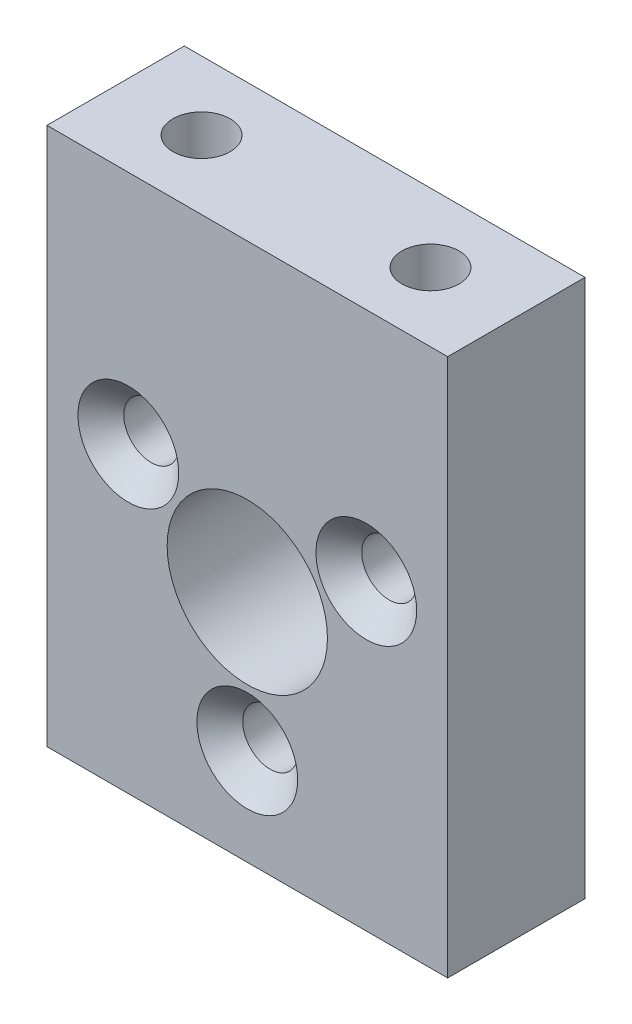
ISO-10303-21;
HEADER;
FILE_DESCRIPTION(('STEP AP214'),'2;1');
FILE_NAME('part.step','',(''),(''),'','','');
FILE_SCHEMA(('AUTOMOTIVE_DESIGN { 1 0 10303 214 1 1 1 1 }'));
ENDSEC;
DATA;
#1=APPLICATION_CONTEXT('core data for automotive mechanical design processes');
#2=APPLICATION_PROTOCOL_DEFINITION('international standard','automotive_design',2000,#1);
#3=PRODUCT_CONTEXT('',#1,'mechanical');
#4=PRODUCT('Part','Part','',(#3));
#5=PRODUCT_RELATED_PRODUCT_CATEGORY('part','',(#4));
#6=PRODUCT_DEFINITION_FORMATION('','',#4);
#7=PRODUCT_DEFINITION_CONTEXT('part definition',#1,'design');
#8=PRODUCT_DEFINITION('design','',#6,#7);
#9=PRODUCT_DEFINITION_SHAPE('','',#8);
#10=(LENGTH_UNIT() NAMED_UNIT(*) SI_UNIT(.MILLI.,.METRE.));
#11=(NAMED_UNIT(*) PLANE_ANGLE_UNIT() SI_UNIT($,.RADIAN.));
#12=(NAMED_UNIT(*) SI_UNIT($,.STERADIAN.) SOLID_ANGLE_UNIT());
#13=UNCERTAINTY_MEASURE_WITH_UNIT(LENGTH_MEASURE(1.E-05),#10,'distance_accuracy_value','');
#14=(GEOMETRIC_REPRESENTATION_CONTEXT(3) GLOBAL_UNCERTAINTY_ASSIGNED_CONTEXT((#13)) GLOBAL_UNIT_ASSIGNED_CONTEXT((#10,
#11,#12)) REPRESENTATION_CONTEXT('',''));
#15=CARTESIAN_POINT('',(0.,0.,0.));
#16=DIRECTION('',(0.,0.,1.));
#17=DIRECTION('',(1.,0.,0.));
#18=AXIS2_PLACEMENT_3D('',#15,#16,#17);
#19=CARTESIAN_POINT('',(0.,0.,3.));
#20=DIRECTION('',(0.,0.,-1.));
#21=DIRECTION('',(-1.,0.,0.));
#22=AXIS2_PLACEMENT_3D('',#19,#20,#21);
#23=PLANE('',#22);
#24=CARTESIAN_POINT('',(0.,-7.53,3.));
#25=DIRECTION('',(0.,0.,1.));
#26=DIRECTION('',(1.,0.,0.));
#27=AXIS2_PLACEMENT_3D('',#24,#25,#26);
#28=CIRCLE('',#27,2.2);
#29=CARTESIAN_POINT('',(2.2,-7.53,3.));
#30=VERTEX_POINT('',#29);
#31=EDGE_CURVE('E139',#30,#30,#28,.T.);
#32=ORIENTED_EDGE('',*,*,#31,.F.);
#33=EDGE_LOOP('',(#32));
#34=FACE_BOUND('',#33,.T.);
#35=CARTESIAN_POINT('',(-5.19615242270663,1.47,3.));
#36=DIRECTION('',(0.,0.,1.));
#37=DIRECTION('',(1.,0.,0.));
#38=AXIS2_PLACEMENT_3D('',#35,#36,#37);
#39=CIRCLE('',#38,2.2);
#40=CARTESIAN_POINT('',(-2.99615242270663,1.47,3.));
#41=VERTEX_POINT('',#40);
#42=EDGE_CURVE('E151',#41,#41,#39,.T.);
#43=ORIENTED_EDGE('',*,*,#42,.F.);
#44=EDGE_LOOP('',(#43));
#45=FACE_BOUND('',#44,.T.);
#46=CARTESIAN_POINT('',(5.19615242270663,1.47,3.));
#47=DIRECTION('',(0.,0.,1.));
#48=DIRECTION('',(1.,0.,0.));
#49=AXIS2_PLACEMENT_3D('',#46,#47,#48);
#50=CIRCLE('',#49,2.2);
#51=CARTESIAN_POINT('',(7.39615242270663,1.47,3.));
#52=VERTEX_POINT('',#51);
#53=EDGE_CURVE('E163',#52,#52,#50,.T.);
#54=ORIENTED_EDGE('',*,*,#53,.F.);
#55=EDGE_LOOP('',(#54));
#56=FACE_BOUND('',#55,.T.);
#57=DIRECTION('',(0.,1.,0.));
#58=VECTOR('',#57,1.);
#59=CARTESIAN_POINT('',(8.75,-11.75,3.));
#60=LINE('',#59,#58);
#61=CARTESIAN_POINT('',(8.75,-11.75,3.));
#62=VERTEX_POINT('',#61);
#63=CARTESIAN_POINT('',(8.75,11.75,3.));
#64=VERTEX_POINT('',#63);
#65=EDGE_CURVE('E184',#62,#64,#60,.T.);
#66=ORIENTED_EDGE('',*,*,#65,.T.);
#67=DIRECTION('',(-1.,0.,0.));
#68=VECTOR('',#67,1.);
#69=CARTESIAN_POINT('',(-8.75,11.75,3.));
#70=LINE('',#69,#68);
#71=CARTESIAN_POINT('',(-8.75,11.75,3.));
#72=VERTEX_POINT('',#71);
#73=EDGE_CURVE('E106',#64,#72,#70,.T.);
#74=ORIENTED_EDGE('',*,*,#73,.T.);
#75=DIRECTION('',(0.,-1.,0.));
#76=VECTOR('',#75,1.);
#77=CARTESIAN_POINT('',(-8.75,-11.75,3.));
#78=LINE('',#77,#76);
#79=CARTESIAN_POINT('',(-8.75,-11.75,3.));
#80=VERTEX_POINT('',#79);
#81=EDGE_CURVE('E189',#72,#80,#78,.T.);
#82=ORIENTED_EDGE('',*,*,#81,.T.);
#83=DIRECTION('',(1.,0.,0.));
#84=VECTOR('',#83,1.);
#85=CARTESIAN_POINT('',(-8.75,-11.75,3.));
#86=LINE('',#85,#84);
#87=EDGE_CURVE('E75',#80,#62,#86,.T.);
#88=ORIENTED_EDGE('',*,*,#87,.T.);
#89=EDGE_LOOP('',(#66,#74,#82,#88));
#90=FACE_BOUND('',#89,.T.);
#91=CARTESIAN_POINT('',(0.,-1.53,3.));
#92=DIRECTION('',(0.,0.,1.));
#93=DIRECTION('',(1.,0.,0.));
#94=AXIS2_PLACEMENT_3D('',#91,#92,#93);
#95=CIRCLE('',#94,3.5);
#96=CARTESIAN_POINT('',(3.5,-1.53,3.));
#97=VERTEX_POINT('',#96);
#98=EDGE_CURVE('E176',#97,#97,#95,.T.);
#99=ORIENTED_EDGE('',*,*,#98,.F.);
#100=EDGE_LOOP('',(#99));
#101=FACE_BOUND('',#100,.T.);
#102=ADVANCED_FACE('F57',(#34,#45,#56,#90,#101),#23,.F.);
#103=CARTESIAN_POINT('',(0.,0.,-3.));
#104=DIRECTION('',(0.,0.,-1.));
#105=DIRECTION('',(-1.,0.,0.));
#106=AXIS2_PLACEMENT_3D('',#103,#104,#105);
#107=PLANE('',#106);
#108=CARTESIAN_POINT('',(0.,-7.53,-3.));
#109=DIRECTION('',(0.,0.,1.));
#110=DIRECTION('',(1.,0.,0.));
#111=AXIS2_PLACEMENT_3D('',#108,#109,#110);
#112=CIRCLE('',#111,1.2);
#113=CARTESIAN_POINT('',(1.2,-7.53,-3.));
#114=VERTEX_POINT('',#113);
#115=EDGE_CURVE('E147',#114,#114,#112,.T.);
#116=ORIENTED_EDGE('',*,*,#115,.T.);
#117=EDGE_LOOP('',(#116));
#118=FACE_BOUND('',#117,.T.);
#119=CARTESIAN_POINT('',(-5.19615242270663,1.47,-3.));
#120=DIRECTION('',(0.,0.,1.));
#121=DIRECTION('',(1.,0.,0.));
#122=AXIS2_PLACEMENT_3D('',#119,#120,#121);
#123=CIRCLE('',#122,1.2);
#124=CARTESIAN_POINT('',(-3.99615242270664,1.47,-3.));
#125=VERTEX_POINT('',#124);
#126=EDGE_CURVE('E159',#125,#125,#123,.T.);
#127=ORIENTED_EDGE('',*,*,#126,.T.);
#128=EDGE_LOOP('',(#127));
#129=FACE_BOUND('',#128,.T.);
#130=CARTESIAN_POINT('',(5.19615242270663,1.47,-3.));
#131=DIRECTION('',(0.,0.,1.));
#132=DIRECTION('',(1.,0.,0.));
#133=AXIS2_PLACEMENT_3D('',#130,#131,#132);
#134=CIRCLE('',#133,1.2);
#135=CARTESIAN_POINT('',(6.39615242270663,1.47,-3.));
#136=VERTEX_POINT('',#135);
#137=EDGE_CURVE('E171',#136,#136,#134,.T.);
#138=ORIENTED_EDGE('',*,*,#137,.T.);
#139=EDGE_LOOP('',(#138));
#140=FACE_BOUND('',#139,.T.);
#141=DIRECTION('',(0.,1.,0.));
#142=VECTOR('',#141,1.);
#143=CARTESIAN_POINT('',(8.75,-11.75,-3.));
#144=LINE('',#143,#142);
#145=CARTESIAN_POINT('',(8.75,-11.75,-3.));
#146=VERTEX_POINT('',#145);
#147=CARTESIAN_POINT('',(8.75,11.75,-3.));
#148=VERTEX_POINT('',#147);
#149=EDGE_CURVE('E180',#146,#148,#144,.T.);
#150=ORIENTED_EDGE('',*,*,#149,.F.);
#151=DIRECTION('',(1.,0.,0.));
#152=VECTOR('',#151,1.);
#153=CARTESIAN_POINT('',(-8.75,-11.75,-3.));
#154=LINE('',#153,#152);
#155=CARTESIAN_POINT('',(-8.75,-11.75,-3.));
#156=VERTEX_POINT('',#155);
#157=EDGE_CURVE('E99',#156,#146,#154,.T.);
#158=ORIENTED_EDGE('',*,*,#157,.F.);
#159=DIRECTION('',(0.,-1.,0.));
#160=VECTOR('',#159,1.);
#161=CARTESIAN_POINT('',(-8.75,-11.75,-3.));
#162=LINE('',#161,#160);
#163=CARTESIAN_POINT('',(-8.75,11.75,-3.));
#164=VERTEX_POINT('',#163);
#165=EDGE_CURVE('E93',#164,#156,#162,.T.);
#166=ORIENTED_EDGE('',*,*,#165,.F.);
#167=DIRECTION('',(-1.,0.,0.));
#168=VECTOR('',#167,1.);
#169=CARTESIAN_POINT('',(-8.75,11.75,-3.));
#170=LINE('',#169,#168);
#171=EDGE_CURVE('E198',#148,#164,#170,.T.);
#172=ORIENTED_EDGE('',*,*,#171,.F.);
#173=EDGE_LOOP('',(#150,#158,#166,#172));
#174=FACE_BOUND('',#173,.T.);
#175=CARTESIAN_POINT('',(0.,-1.53,-3.));
#176=DIRECTION('',(0.,0.,1.));
#177=DIRECTION('',(1.,0.,0.));
#178=AXIS2_PLACEMENT_3D('',#175,#176,#177);
#179=CIRCLE('',#178,3.5);
#180=CARTESIAN_POINT('',(3.5,-1.53,-3.));
#181=VERTEX_POINT('',#180);
#182=EDGE_CURVE('E175',#181,#181,#179,.T.);
#183=ORIENTED_EDGE('',*,*,#182,.T.);
#184=EDGE_LOOP('',(#183));
#185=FACE_BOUND('',#184,.T.);
#186=ADVANCED_FACE('F215',(#118,#129,#140,#174,#185),#107,.T.);
#187=CARTESIAN_POINT('',(8.75,-11.75,3.));
#188=DIRECTION('',(-1.,0.,0.));
#189=DIRECTION('',(0.,0.,1.));
#190=AXIS2_PLACEMENT_3D('',#187,#188,#189);
#191=PLANE('',#190);
#192=ORIENTED_EDGE('',*,*,#149,.T.);
#193=DIRECTION('',(0.,0.,-1.));
#194=VECTOR('',#193,1.);
#195=CARTESIAN_POINT('',(8.75,11.75,3.));
#196=LINE('',#195,#194);
#197=EDGE_CURVE('E13',#64,#148,#196,.T.);
#198=ORIENTED_EDGE('',*,*,#197,.F.);
#199=ORIENTED_EDGE('',*,*,#65,.F.);
#200=DIRECTION('',(0.,0.,-1.));
#201=VECTOR('',#200,1.);
#202=CARTESIAN_POINT('',(8.75,-11.75,3.));
#203=LINE('',#202,#201);
#204=EDGE_CURVE('E194',#62,#146,#203,.T.);
#205=ORIENTED_EDGE('',*,*,#204,.T.);
#206=EDGE_LOOP('',(#192,#198,#199,#205));
#207=FACE_BOUND('',#206,.T.);
#208=ADVANCED_FACE('F59',(#207),#191,.F.);
#209=CARTESIAN_POINT('',(-8.75,11.75,3.));
#210=DIRECTION('',(0.,-1.,0.));
#211=DIRECTION('',(0.,0.,-1.));
#212=AXIS2_PLACEMENT_3D('',#209,#210,#211);
#213=PLANE('',#212);
#214=CARTESIAN_POINT('',(-5.,11.75,0.));
#215=DIRECTION('',(0.,1.,0.));
#216=DIRECTION('',(0.,0.,1.));
#217=AXIS2_PLACEMENT_3D('',#214,#215,#216);
#218=CIRCLE('',#217,1.24999999999999);
#219=CARTESIAN_POINT('',(-5.,11.75,1.24999999999999));
#220=VERTEX_POINT('',#219);
#221=EDGE_CURVE('E125',#220,#220,#218,.T.);
#222=ORIENTED_EDGE('',*,*,#221,.F.);
#223=EDGE_LOOP('',(#222));
#224=FACE_BOUND('',#223,.T.);
#225=CARTESIAN_POINT('',(5.,11.75,0.));
#226=DIRECTION('',(0.,1.,0.));
#227=DIRECTION('',(0.,0.,1.));
#228=AXIS2_PLACEMENT_3D('',#225,#226,#227);
#229=CIRCLE('',#228,1.24999999999999);
#230=CARTESIAN_POINT('',(5.,11.75,1.24999999999999));
#231=VERTEX_POINT('',#230);
#232=EDGE_CURVE('E124',#231,#231,#229,.T.);
#233=ORIENTED_EDGE('',*,*,#232,.F.);
#234=EDGE_LOOP('',(#233));
#235=FACE_BOUND('',#234,.T.);
#236=ORIENTED_EDGE('',*,*,#171,.T.);
#237=DIRECTION('',(0.,0.,-1.));
#238=VECTOR('',#237,1.);
#239=CARTESIAN_POINT('',(-8.75,11.75,3.));
#240=LINE('',#239,#238);
#241=EDGE_CURVE('E67',#72,#164,#240,.T.);
#242=ORIENTED_EDGE('',*,*,#241,.F.);
#243=ORIENTED_EDGE('',*,*,#73,.F.);
#244=ORIENTED_EDGE('',*,*,#197,.T.);
#245=EDGE_LOOP('',(#236,#242,#243,#244));
#246=FACE_BOUND('',#245,.T.);
#247=ADVANCED_FACE('F231',(#224,#235,#246),#213,.F.);
#248=CARTESIAN_POINT('',(-8.75,-11.75,3.));
#249=DIRECTION('',(1.,0.,0.));
#250=DIRECTION('',(0.,0.,-1.));
#251=AXIS2_PLACEMENT_3D('',#248,#249,#250);
#252=PLANE('',#251);
#253=ORIENTED_EDGE('',*,*,#165,.T.);
#254=DIRECTION('',(0.,0.,-1.));
#255=VECTOR('',#254,1.);
#256=CARTESIAN_POINT('',(-8.75,-11.75,3.));
#257=LINE('',#256,#255);
#258=EDGE_CURVE('E207',#80,#156,#257,.T.);
#259=ORIENTED_EDGE('',*,*,#258,.F.);
#260=ORIENTED_EDGE('',*,*,#81,.F.);
#261=ORIENTED_EDGE('',*,*,#241,.T.);
#262=EDGE_LOOP('',(#253,#259,#260,#261));
#263=FACE_BOUND('',#262,.T.);
#264=ADVANCED_FACE('F212',(#263),#252,.F.);
#265=CARTESIAN_POINT('',(-8.75,-11.75,3.));
#266=DIRECTION('',(0.,1.,0.));
#267=DIRECTION('',(0.,0.,1.));
#268=AXIS2_PLACEMENT_3D('',#265,#266,#267);
#269=PLANE('',#268);
#270=ORIENTED_EDGE('',*,*,#157,.T.);
#271=ORIENTED_EDGE('',*,*,#204,.F.);
#272=ORIENTED_EDGE('',*,*,#87,.F.);
#273=ORIENTED_EDGE('',*,*,#258,.T.);
#274=EDGE_LOOP('',(#270,#271,#272,#273));
#275=FACE_BOUND('',#274,.T.);
#276=ADVANCED_FACE('F220',(#275),#269,.F.);
#277=CARTESIAN_POINT('',(0.,-1.53,3.));
#278=DIRECTION('',(0.,0.,-1.));
#279=DIRECTION('',(-1.,0.,0.));
#280=AXIS2_PLACEMENT_3D('',#277,#278,#279);
#281=CYLINDRICAL_SURFACE('',#280,3.5);
#282=ORIENTED_EDGE('',*,*,#98,.T.);
#283=EDGE_LOOP('',(#282));
#284=FACE_BOUND('',#283,.T.);
#285=ORIENTED_EDGE('',*,*,#182,.F.);
#286=EDGE_LOOP('',(#285));
#287=FACE_BOUND('',#286,.T.);
#288=ADVANCED_FACE('F222',(#284,#287),#281,.F.);
#289=CARTESIAN_POINT('',(5.19615242270663,1.47,3.));
#290=DIRECTION('',(0.,0.,1.));
#291=DIRECTION('',(1.,0.,0.));
#292=AXIS2_PLACEMENT_3D('',#289,#290,#291);
#293=CYLINDRICAL_SURFACE('',#292,1.2);
#294=ORIENTED_EDGE('',*,*,#137,.F.);
#295=EDGE_LOOP('',(#294));
#296=FACE_BOUND('',#295,.T.);
#297=CARTESIAN_POINT('',(5.19615242270663,1.47,2.));
#298=DIRECTION('',(0.,0.,1.));
#299=DIRECTION('',(1.,0.,0.));
#300=AXIS2_PLACEMENT_3D('',#297,#298,#299);
#301=CIRCLE('',#300,1.2);
#302=CARTESIAN_POINT('',(6.39615242270663,1.47,2.));
#303=VERTEX_POINT('',#302);
#304=EDGE_CURVE('E167',#303,#303,#301,.T.);
#305=ORIENTED_EDGE('',*,*,#304,.T.);
#306=EDGE_LOOP('',(#305));
#307=FACE_BOUND('',#306,.T.);
#308=ADVANCED_FACE('F228',(#296,#307),#293,.F.);
#309=CARTESIAN_POINT('',(5.19615242270663,1.47,3.));
#310=DIRECTION('',(0.,0.,1.));
#311=DIRECTION('',(1.,0.,0.));
#312=AXIS2_PLACEMENT_3D('',#309,#310,#311);
#313=CONICAL_SURFACE('',#312,2.2,0.785398163397448);
#314=ORIENTED_EDGE('',*,*,#304,.F.);
#315=EDGE_LOOP('',(#314));
#316=FACE_BOUND('',#315,.T.);
#317=ORIENTED_EDGE('',*,*,#53,.T.);
#318=EDGE_LOOP('',(#317));
#319=FACE_BOUND('',#318,.T.);
#320=ADVANCED_FACE('F246',(#316,#319),#313,.F.);
#321=CARTESIAN_POINT('',(-5.19615242270663,1.47,3.));
#322=DIRECTION('',(0.,0.,1.));
#323=DIRECTION('',(1.,0.,0.));
#324=AXIS2_PLACEMENT_3D('',#321,#322,#323);
#325=CYLINDRICAL_SURFACE('',#324,1.2);
#326=ORIENTED_EDGE('',*,*,#126,.F.);
#327=EDGE_LOOP('',(#326));
#328=FACE_BOUND('',#327,.T.);
#329=CARTESIAN_POINT('',(-5.19615242270663,1.47,2.));
#330=DIRECTION('',(0.,0.,1.));
#331=DIRECTION('',(1.,0.,0.));
#332=AXIS2_PLACEMENT_3D('',#329,#330,#331);
#333=CIRCLE('',#332,1.2);
#334=CARTESIAN_POINT('',(-3.99615242270663,1.47,2.));
#335=VERTEX_POINT('',#334);
#336=EDGE_CURVE('E155',#335,#335,#333,.T.);
#337=ORIENTED_EDGE('',*,*,#336,.T.);
#338=EDGE_LOOP('',(#337));
#339=FACE_BOUND('',#338,.T.);
#340=ADVANCED_FACE('F250',(#328,#339),#325,.F.);
#341=CARTESIAN_POINT('',(-5.19615242270663,1.47,3.));
#342=DIRECTION('',(0.,0.,1.));
#343=DIRECTION('',(1.,0.,0.));
#344=AXIS2_PLACEMENT_3D('',#341,#342,#343);
#345=CONICAL_SURFACE('',#344,2.2,0.785398163397448);
#346=ORIENTED_EDGE('',*,*,#336,.F.);
#347=EDGE_LOOP('',(#346));
#348=FACE_BOUND('',#347,.T.);
#349=ORIENTED_EDGE('',*,*,#42,.T.);
#350=EDGE_LOOP('',(#349));
#351=FACE_BOUND('',#350,.T.);
#352=ADVANCED_FACE('F254',(#348,#351),#345,.F.);
#353=CARTESIAN_POINT('',(0.,-7.53,3.));
#354=DIRECTION('',(0.,0.,1.));
#355=DIRECTION('',(1.,0.,0.));
#356=AXIS2_PLACEMENT_3D('',#353,#354,#355);
#357=CYLINDRICAL_SURFACE('',#356,1.2);
#358=ORIENTED_EDGE('',*,*,#115,.F.);
#359=EDGE_LOOP('',(#358));
#360=FACE_BOUND('',#359,.T.);
#361=CARTESIAN_POINT('',(0.,-7.53,2.));
#362=DIRECTION('',(0.,0.,1.));
#363=DIRECTION('',(1.,0.,0.));
#364=AXIS2_PLACEMENT_3D('',#361,#362,#363);
#365=CIRCLE('',#364,1.2);
#366=CARTESIAN_POINT('',(1.2,-7.53,2.));
#367=VERTEX_POINT('',#366);
#368=EDGE_CURVE('E143',#367,#367,#365,.T.);
#369=ORIENTED_EDGE('',*,*,#368,.T.);
#370=EDGE_LOOP('',(#369));
#371=FACE_BOUND('',#370,.T.);
#372=ADVANCED_FACE('F258',(#360,#371),#357,.F.);
#373=CARTESIAN_POINT('',(0.,-7.53,3.));
#374=DIRECTION('',(0.,0.,1.));
#375=DIRECTION('',(1.,0.,0.));
#376=AXIS2_PLACEMENT_3D('',#373,#374,#375);
#377=CONICAL_SURFACE('',#376,2.2,0.785398163397448);
#378=ORIENTED_EDGE('',*,*,#368,.F.);
#379=EDGE_LOOP('',(#378));
#380=FACE_BOUND('',#379,.T.);
#381=ORIENTED_EDGE('',*,*,#31,.T.);
#382=EDGE_LOOP('',(#381));
#383=FACE_BOUND('',#382,.T.);
#384=ADVANCED_FACE('F262',(#380,#383),#377,.F.);
#385=CARTESIAN_POINT('',(5.,5.75,0.));
#386=DIRECTION('',(0.,1.,0.));
#387=DIRECTION('',(0.,0.,1.));
#388=AXIS2_PLACEMENT_3D('',#385,#386,#387);
#389=CONICAL_SURFACE('',#388,1.25,1.02974425867665);
#390=CARTESIAN_POINT('',(5.,4.99892422621555,0.));
#391=VERTEX_POINT('',#390);
#392=VERTEX_LOOP('',#391);
#393=FACE_BOUND('',#392,.T.);
#394=CARTESIAN_POINT('',(5.,5.75,0.));
#395=DIRECTION('',(0.,1.,0.));
#396=DIRECTION('',(0.,0.,1.));
#397=AXIS2_PLACEMENT_3D('',#394,#395,#396);
#398=CIRCLE('',#397,1.25);
#399=CARTESIAN_POINT('',(5.,5.75,1.25));
#400=VERTEX_POINT('',#399);
#401=EDGE_CURVE('E131',#400,#400,#398,.T.);
#402=ORIENTED_EDGE('',*,*,#401,.T.);
#403=EDGE_LOOP('',(#402));
#404=FACE_BOUND('',#403,.T.);
#405=ADVANCED_FACE('F266',(#393,#404),#389,.F.);
#406=CARTESIAN_POINT('',(5.,11.75,0.));
#407=DIRECTION('',(0.,1.,0.));
#408=DIRECTION('',(0.,0.,1.));
#409=AXIS2_PLACEMENT_3D('',#406,#407,#408);
#410=CYLINDRICAL_SURFACE('',#409,1.24999999999999);
#411=ORIENTED_EDGE('',*,*,#401,.F.);
#412=EDGE_LOOP('',(#411));
#413=FACE_BOUND('',#412,.T.);
#414=ORIENTED_EDGE('',*,*,#232,.T.);
#415=EDGE_LOOP('',(#414));
#416=FACE_BOUND('',#415,.T.);
#417=ADVANCED_FACE('F117',(#413,#416),#410,.F.);
#418=CARTESIAN_POINT('',(-5.,5.75,0.));
#419=DIRECTION('',(0.,1.,0.));
#420=DIRECTION('',(0.,0.,1.));
#421=AXIS2_PLACEMENT_3D('',#418,#419,#420);
#422=CONICAL_SURFACE('',#421,1.25,1.02974425867665);
#423=CARTESIAN_POINT('',(-5.,4.99892422621555,0.));
#424=VERTEX_POINT('',#423);
#425=VERTEX_LOOP('',#424);
#426=FACE_BOUND('',#425,.T.);
#427=CARTESIAN_POINT('',(-5.,5.75,0.));
#428=DIRECTION('',(0.,1.,0.));
#429=DIRECTION('',(0.,0.,1.));
#430=AXIS2_PLACEMENT_3D('',#427,#428,#429);
#431=CIRCLE('',#430,1.25);
#432=CARTESIAN_POINT('',(-5.,5.75,1.25));
#433=VERTEX_POINT('',#432);
#434=EDGE_CURVE('E121',#433,#433,#431,.T.);
#435=ORIENTED_EDGE('',*,*,#434,.T.);
#436=EDGE_LOOP('',(#435));
#437=FACE_BOUND('',#436,.T.);
#438=ADVANCED_FACE('F113',(#426,#437),#422,.F.);
#439=CARTESIAN_POINT('',(-5.,11.75,0.));
#440=DIRECTION('',(0.,1.,0.));
#441=DIRECTION('',(0.,0.,1.));
#442=AXIS2_PLACEMENT_3D('',#439,#440,#441);
#443=CYLINDRICAL_SURFACE('',#442,1.24999999999999);
#444=ORIENTED_EDGE('',*,*,#434,.F.);
#445=EDGE_LOOP('',(#444));
#446=FACE_BOUND('',#445,.T.);
#447=ORIENTED_EDGE('',*,*,#221,.T.);
#448=EDGE_LOOP('',(#447));
#449=FACE_BOUND('',#448,.T.);
#450=ADVANCED_FACE('F116',(#446,#449),#443,.F.);
#451=CLOSED_SHELL('',(#102,#186,#208,#247,#264,#276,#288,#308,#320,#340,#352,#372,#384,#405,
#417,#438,#450));
#452=MANIFOLD_SOLID_BREP('B2',#451);
#453=ADVANCED_BREP_SHAPE_REPRESENTATION('',(#18,#452),#14);
#454=SHAPE_DEFINITION_REPRESENTATION(#9,#453);
ENDSEC;
END-ISO-10303-21;
